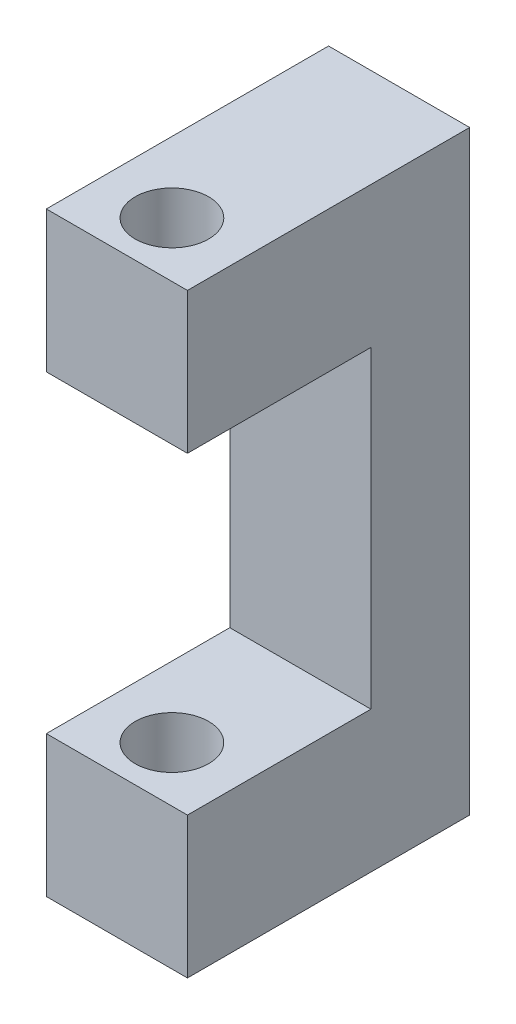
ISO-10303-21;
HEADER;
FILE_DESCRIPTION(('STEP AP214'),'2;1');
FILE_NAME('part.step','',(''),(''),'','','');
FILE_SCHEMA(('AUTOMOTIVE_DESIGN { 1 0 10303 214 1 1 1 1 }'));
ENDSEC;
DATA;
#1=APPLICATION_CONTEXT('core data for automotive mechanical design processes');
#2=APPLICATION_PROTOCOL_DEFINITION('international standard','automotive_design',2000,#1);
#3=PRODUCT_CONTEXT('',#1,'mechanical');
#4=PRODUCT('Part','Part','',(#3));
#5=PRODUCT_RELATED_PRODUCT_CATEGORY('part','',(#4));
#6=PRODUCT_DEFINITION_FORMATION('','',#4);
#7=PRODUCT_DEFINITION_CONTEXT('part definition',#1,'design');
#8=PRODUCT_DEFINITION('design','',#6,#7);
#9=PRODUCT_DEFINITION_SHAPE('','',#8);
#10=(LENGTH_UNIT() NAMED_UNIT(*) SI_UNIT(.MILLI.,.METRE.));
#11=(NAMED_UNIT(*) PLANE_ANGLE_UNIT() SI_UNIT($,.RADIAN.));
#12=(NAMED_UNIT(*) SI_UNIT($,.STERADIAN.) SOLID_ANGLE_UNIT());
#13=UNCERTAINTY_MEASURE_WITH_UNIT(LENGTH_MEASURE(1.E-05),#10,'distance_accuracy_value','');
#14=(GEOMETRIC_REPRESENTATION_CONTEXT(3) GLOBAL_UNCERTAINTY_ASSIGNED_CONTEXT((#13)) GLOBAL_UNIT_ASSIGNED_CONTEXT((#10,
#11,#12)) REPRESENTATION_CONTEXT('',''));
#15=CARTESIAN_POINT('',(0.,0.,0.));
#16=DIRECTION('',(0.,0.,1.));
#17=DIRECTION('',(1.,0.,0.));
#18=AXIS2_PLACEMENT_3D('',#15,#16,#17);
#19=CARTESIAN_POINT('',(-5.,-72.7336092564536,3.));
#20=DIRECTION('',(0.,0.,-1.));
#21=DIRECTION('',(-1.,0.,0.));
#22=AXIS2_PLACEMENT_3D('',#19,#20,#21);
#23=CYLINDRICAL_SURFACE('',#22,2.1);
#24=CARTESIAN_POINT('',(-5.,-72.7336092564536,6.));
#25=DIRECTION('',(0.,0.,1.));
#26=DIRECTION('',(1.,0.,0.));
#27=AXIS2_PLACEMENT_3D('',#24,#25,#26);
#28=CIRCLE('',#27,2.1);
#29=CARTESIAN_POINT('',(-2.9,-72.7336092564536,6.));
#30=VERTEX_POINT('',#29);
#31=EDGE_CURVE('E94',#30,#30,#28,.F.);
#32=ORIENTED_EDGE('',*,*,#31,.F.);
#33=EDGE_LOOP('',(#32));
#34=FACE_BOUND('',#33,.T.);
#35=CARTESIAN_POINT('',(-5.,-72.7336092564536,-2.));
#36=DIRECTION('',(0.,0.,-1.));
#37=DIRECTION('',(-1.,0.,0.));
#38=AXIS2_PLACEMENT_3D('',#35,#36,#37);
#39=CIRCLE('',#38,2.10000000000001);
#40=CARTESIAN_POINT('',(-7.10000000000001,-72.7336092564536,-2.));
#41=VERTEX_POINT('',#40);
#42=EDGE_CURVE('E190',#41,#41,#39,.T.);
#43=ORIENTED_EDGE('',*,*,#42,.T.);
#44=EDGE_LOOP('',(#43));
#45=FACE_BOUND('',#44,.T.);
#46=ADVANCED_FACE('F45',(#34,#45),#23,.F.);
#47=CARTESIAN_POINT('',(0.,0.,6.));
#48=DIRECTION('',(0.,0.,-1.));
#49=DIRECTION('',(-1.,0.,0.));
#50=AXIS2_PLACEMENT_3D('',#47,#48,#49);
#51=PLANE('',#50);
#52=ORIENTED_EDGE('',*,*,#31,.T.);
#53=EDGE_LOOP('',(#52));
#54=FACE_BOUND('',#53,.T.);
#55=ADVANCED_FACE('F202',(#54),#51,.T.);
#56=CARTESIAN_POINT('',(0.,0.,-2.));
#57=DIRECTION('',(0.,0.,-1.));
#58=DIRECTION('',(-1.,0.,0.));
#59=AXIS2_PLACEMENT_3D('',#56,#57,#58);
#60=PLANE('',#59);
#61=ORIENTED_EDGE('',*,*,#42,.F.);
#62=EDGE_LOOP('',(#61));
#63=FACE_BOUND('',#62,.T.);
#64=DIRECTION('',(0.,1.,0.));
#65=VECTOR('',#64,1.);
#66=CARTESIAN_POINT('',(-10.,-79.7336092564536,-2.));
#67=LINE('',#66,#65);
#68=CARTESIAN_POINT('',(-10.,-79.7336092564536,-2.));
#69=VERTEX_POINT('',#68);
#70=CARTESIAN_POINT('',(-10.,-37.5336092564536,-2.));
#71=VERTEX_POINT('',#70);
#72=EDGE_CURVE('E161',#69,#71,#67,.T.);
#73=ORIENTED_EDGE('',*,*,#72,.T.);
#74=DIRECTION('',(1.,0.,0.));
#75=VECTOR('',#74,1.);
#76=CARTESIAN_POINT('',(-10.,-37.5336092564536,-2.));
#77=LINE('',#76,#75);
#78=CARTESIAN_POINT('',(0.,-37.5336092564536,-2.));
#79=VERTEX_POINT('',#78);
#80=EDGE_CURVE('E186',#71,#79,#77,.T.);
#81=ORIENTED_EDGE('',*,*,#80,.T.);
#82=DIRECTION('',(0.,-1.,0.));
#83=VECTOR('',#82,1.);
#84=CARTESIAN_POINT('',(0.,-79.7336092564536,-2.));
#85=LINE('',#84,#83);
#86=CARTESIAN_POINT('',(0.,-79.7336092564536,-2.));
#87=VERTEX_POINT('',#86);
#88=EDGE_CURVE('E183',#79,#87,#85,.T.);
#89=ORIENTED_EDGE('',*,*,#88,.T.);
#90=DIRECTION('',(-1.,0.,0.));
#91=VECTOR('',#90,1.);
#92=CARTESIAN_POINT('',(-10.,-79.7336092564536,-2.));
#93=LINE('',#92,#91);
#94=EDGE_CURVE('E181',#87,#69,#93,.T.);
#95=ORIENTED_EDGE('',*,*,#94,.T.);
#96=EDGE_LOOP('',(#73,#81,#89,#95));
#97=FACE_BOUND('',#96,.T.);
#98=CARTESIAN_POINT('',(-5.,-44.5336092564536,-2.));
#99=DIRECTION('',(0.,0.,-1.));
#100=DIRECTION('',(-1.,0.,0.));
#101=AXIS2_PLACEMENT_3D('',#98,#99,#100);
#102=CIRCLE('',#101,2.10000000000001);
#103=CARTESIAN_POINT('',(-7.10000000000001,-44.5336092564536,-2.));
#104=VERTEX_POINT('',#103);
#105=EDGE_CURVE('E193',#104,#104,#102,.T.);
#106=ORIENTED_EDGE('',*,*,#105,.F.);
#107=EDGE_LOOP('',(#106));
#108=FACE_BOUND('',#107,.T.);
#109=ADVANCED_FACE('F199',(#63,#97,#108),#60,.T.);
#110=CARTESIAN_POINT('',(-5.,-30.7336092564536,14.1));
#111=DIRECTION('',(0.,-1.,0.));
#112=DIRECTION('',(0.,0.,-1.));
#113=AXIS2_PLACEMENT_3D('',#110,#111,#112);
#114=CYLINDRICAL_SURFACE('',#113,2.6);
#115=CARTESIAN_POINT('',(-5.,-47.5336092564536,14.1));
#116=DIRECTION('',(0.,1.,0.));
#117=DIRECTION('',(0.,0.,1.));
#118=AXIS2_PLACEMENT_3D('',#115,#116,#117);
#119=CIRCLE('',#118,2.6);
#120=CARTESIAN_POINT('',(-5.,-47.5336092564536,16.7));
#121=VERTEX_POINT('',#120);
#122=EDGE_CURVE('E48',#121,#121,#119,.T.);
#123=ORIENTED_EDGE('',*,*,#122,.F.);
#124=EDGE_LOOP('',(#123));
#125=FACE_BOUND('',#124,.T.);
#126=CARTESIAN_POINT('',(-5.,-37.5336092564536,14.1));
#127=DIRECTION('',(0.,1.,0.));
#128=DIRECTION('',(0.,0.,1.));
#129=AXIS2_PLACEMENT_3D('',#126,#127,#128);
#130=CIRCLE('',#129,2.6);
#131=CARTESIAN_POINT('',(-5.,-37.5336092564536,16.7));
#132=VERTEX_POINT('',#131);
#133=EDGE_CURVE('E178',#132,#132,#130,.T.);
#134=ORIENTED_EDGE('',*,*,#133,.T.);
#135=EDGE_LOOP('',(#134));
#136=FACE_BOUND('',#135,.T.);
#137=ADVANCED_FACE('F201',(#125,#136),#114,.F.);
#138=CARTESIAN_POINT('',(0.,-69.7336092564536,6.));
#139=DIRECTION('',(0.,1.,0.));
#140=DIRECTION('',(0.,0.,1.));
#141=AXIS2_PLACEMENT_3D('',#138,#139,#140);
#142=PLANE('',#141);
#143=DIRECTION('',(1.,0.,0.));
#144=VECTOR('',#143,1.);
#145=CARTESIAN_POINT('',(-10.,-69.7336092564536,5.));
#146=LINE('',#145,#144);
#147=CARTESIAN_POINT('',(-10.,-69.7336092564536,5.));
#148=VERTEX_POINT('',#147);
#149=CARTESIAN_POINT('',(0.,-69.7336092564536,5.));
#150=VERTEX_POINT('',#149);
#151=EDGE_CURVE('E141',#148,#150,#146,.T.);
#152=ORIENTED_EDGE('',*,*,#151,.F.);
#153=DIRECTION('',(0.,0.,-1.));
#154=VECTOR('',#153,1.);
#155=CARTESIAN_POINT('',(-10.,-69.7336092564536,6.));
#156=LINE('',#155,#154);
#157=CARTESIAN_POINT('',(-10.,-69.7336092564536,18.));
#158=VERTEX_POINT('',#157);
#159=EDGE_CURVE('E93',#158,#148,#156,.T.);
#160=ORIENTED_EDGE('',*,*,#159,.F.);
#161=DIRECTION('',(-1.,0.,0.));
#162=VECTOR('',#161,1.);
#163=CARTESIAN_POINT('',(0.,-69.7336092564536,18.));
#164=LINE('',#163,#162);
#165=CARTESIAN_POINT('',(0.,-69.7336092564536,18.));
#166=VERTEX_POINT('',#165);
#167=EDGE_CURVE('E97',#166,#158,#164,.T.);
#168=ORIENTED_EDGE('',*,*,#167,.F.);
#169=DIRECTION('',(0.,0.,-1.));
#170=VECTOR('',#169,1.);
#171=CARTESIAN_POINT('',(0.,-69.7336092564536,6.));
#172=LINE('',#171,#170);
#173=EDGE_CURVE('E82',#166,#150,#172,.T.);
#174=ORIENTED_EDGE('',*,*,#173,.T.);
#175=EDGE_LOOP('',(#152,#160,#168,#174));
#176=FACE_BOUND('',#175,.T.);
#177=CARTESIAN_POINT('',(-5.,-69.7336092564536,14.1));
#178=DIRECTION('',(0.,1.,0.));
#179=DIRECTION('',(0.,0.,1.));
#180=AXIS2_PLACEMENT_3D('',#177,#178,#179);
#181=CIRCLE('',#180,2.6);
#182=CARTESIAN_POINT('',(-5.,-69.7336092564536,16.7));
#183=VERTEX_POINT('',#182);
#184=EDGE_CURVE('E140',#183,#183,#181,.T.);
#185=ORIENTED_EDGE('',*,*,#184,.F.);
#186=EDGE_LOOP('',(#185));
#187=FACE_BOUND('',#186,.T.);
#188=ADVANCED_FACE('F98',(#176,#187),#142,.T.);
#189=CARTESIAN_POINT('',(0.,0.,5.));
#190=DIRECTION('',(0.,0.,1.));
#191=DIRECTION('',(1.,0.,0.));
#192=AXIS2_PLACEMENT_3D('',#189,#190,#191);
#193=PLANE('',#192);
#194=DIRECTION('',(0.,-1.,0.));
#195=VECTOR('',#194,1.);
#196=CARTESIAN_POINT('',(-10.,-47.5336092564536,5.));
#197=LINE('',#196,#195);
#198=CARTESIAN_POINT('',(-10.,-47.5336092564536,5.));
#199=VERTEX_POINT('',#198);
#200=EDGE_CURVE('E129',#199,#148,#197,.T.);
#201=ORIENTED_EDGE('',*,*,#200,.T.);
#202=ORIENTED_EDGE('',*,*,#151,.T.);
#203=DIRECTION('',(0.,1.,0.));
#204=VECTOR('',#203,1.);
#205=CARTESIAN_POINT('',(0.,-47.5336092564536,5.));
#206=LINE('',#205,#204);
#207=CARTESIAN_POINT('',(0.,-47.5336092564536,5.));
#208=VERTEX_POINT('',#207);
#209=EDGE_CURVE('E61',#150,#208,#206,.T.);
#210=ORIENTED_EDGE('',*,*,#209,.T.);
#211=DIRECTION('',(-1.,0.,0.));
#212=VECTOR('',#211,1.);
#213=CARTESIAN_POINT('',(-10.,-47.5336092564536,5.));
#214=LINE('',#213,#212);
#215=EDGE_CURVE('E136',#208,#199,#214,.T.);
#216=ORIENTED_EDGE('',*,*,#215,.T.);
#217=EDGE_LOOP('',(#201,#202,#210,#216));
#218=FACE_BOUND('',#217,.T.);
#219=ADVANCED_FACE('F137',(#218),#193,.T.);
#220=CARTESIAN_POINT('',(0.,-47.5336092564536,6.));
#221=DIRECTION('',(0.,1.,0.));
#222=DIRECTION('',(0.,0.,1.));
#223=AXIS2_PLACEMENT_3D('',#220,#221,#222);
#224=PLANE('',#223);
#225=ORIENTED_EDGE('',*,*,#122,.T.);
#226=EDGE_LOOP('',(#225));
#227=FACE_BOUND('',#226,.T.);
#228=DIRECTION('',(0.,0.,-1.));
#229=VECTOR('',#228,1.);
#230=CARTESIAN_POINT('',(-10.,-47.5336092564536,6.));
#231=LINE('',#230,#229);
#232=CARTESIAN_POINT('',(-10.,-47.5336092564536,18.));
#233=VERTEX_POINT('',#232);
#234=EDGE_CURVE('E11',#233,#199,#231,.T.);
#235=ORIENTED_EDGE('',*,*,#234,.T.);
#236=ORIENTED_EDGE('',*,*,#215,.F.);
#237=DIRECTION('',(0.,0.,-1.));
#238=VECTOR('',#237,1.);
#239=CARTESIAN_POINT('',(0.,-47.5336092564536,6.));
#240=LINE('',#239,#238);
#241=CARTESIAN_POINT('',(0.,-47.5336092564536,18.));
#242=VERTEX_POINT('',#241);
#243=EDGE_CURVE('E53',#242,#208,#240,.T.);
#244=ORIENTED_EDGE('',*,*,#243,.F.);
#245=DIRECTION('',(1.,0.,0.));
#246=VECTOR('',#245,1.);
#247=CARTESIAN_POINT('',(-10.,-47.5336092564536,18.));
#248=LINE('',#247,#246);
#249=EDGE_CURVE('E113',#233,#242,#248,.T.);
#250=ORIENTED_EDGE('',*,*,#249,.F.);
#251=EDGE_LOOP('',(#235,#236,#244,#250));
#252=FACE_BOUND('',#251,.T.);
#253=ADVANCED_FACE('F238',(#227,#252),#224,.F.);
#254=CARTESIAN_POINT('',(0.,0.,18.));
#255=DIRECTION('',(0.,0.,1.));
#256=DIRECTION('',(1.,0.,0.));
#257=AXIS2_PLACEMENT_3D('',#254,#255,#256);
#258=PLANE('',#257);
#259=DIRECTION('',(0.,-1.,0.));
#260=VECTOR('',#259,1.);
#261=CARTESIAN_POINT('',(-10.,-41.5336092564536,18.));
#262=LINE('',#261,#260);
#263=CARTESIAN_POINT('',(-10.,-37.5336092564536,18.));
#264=VERTEX_POINT('',#263);
#265=EDGE_CURVE('E110',#264,#233,#262,.T.);
#266=ORIENTED_EDGE('',*,*,#265,.T.);
#267=ORIENTED_EDGE('',*,*,#249,.T.);
#268=DIRECTION('',(0.,1.,0.));
#269=VECTOR('',#268,1.);
#270=CARTESIAN_POINT('',(0.,-41.5336092564536,18.));
#271=LINE('',#270,#269);
#272=CARTESIAN_POINT('',(0.,-37.5336092564536,18.));
#273=VERTEX_POINT('',#272);
#274=EDGE_CURVE('E122',#242,#273,#271,.T.);
#275=ORIENTED_EDGE('',*,*,#274,.T.);
#276=DIRECTION('',(1.,0.,0.));
#277=VECTOR('',#276,1.);
#278=CARTESIAN_POINT('',(0.,-37.5336092564536,18.));
#279=LINE('',#278,#277);
#280=EDGE_CURVE('E166',#264,#273,#279,.T.);
#281=ORIENTED_EDGE('',*,*,#280,.F.);
#282=EDGE_LOOP('',(#266,#267,#275,#281));
#283=FACE_BOUND('',#282,.T.);
#284=ADVANCED_FACE('F235',(#283),#258,.T.);
#285=ORIENTED_EDGE('',*,*,#184,.T.);
#286=EDGE_LOOP('',(#285));
#287=FACE_BOUND('',#286,.T.);
#288=CARTESIAN_POINT('',(-5.,-79.7336092564536,14.1));
#289=DIRECTION('',(0.,-1.,0.));
#290=DIRECTION('',(0.,0.,-1.));
#291=AXIS2_PLACEMENT_3D('',#288,#289,#290);
#292=CIRCLE('',#291,2.6);
#293=CARTESIAN_POINT('',(-5.,-79.7336092564536,11.5));
#294=VERTEX_POINT('',#293);
#295=EDGE_CURVE('E162',#294,#294,#292,.T.);
#296=ORIENTED_EDGE('',*,*,#295,.T.);
#297=EDGE_LOOP('',(#296));
#298=FACE_BOUND('',#297,.T.);
#299=ADVANCED_FACE('F212',(#287,#298),#114,.F.);
#300=CARTESIAN_POINT('',(0.,0.,18.));
#301=DIRECTION('',(0.,0.,-1.));
#302=DIRECTION('',(-1.,0.,0.));
#303=AXIS2_PLACEMENT_3D('',#300,#301,#302);
#304=PLANE('',#303);
#305=DIRECTION('',(0.,1.,0.));
#306=VECTOR('',#305,1.);
#307=CARTESIAN_POINT('',(0.,-69.7336092564536,18.));
#308=LINE('',#307,#306);
#309=CARTESIAN_POINT('',(0.,-79.7336092564536,18.));
#310=VERTEX_POINT('',#309);
#311=EDGE_CURVE('E88',#310,#166,#308,.T.);
#312=ORIENTED_EDGE('',*,*,#311,.T.);
#313=ORIENTED_EDGE('',*,*,#167,.T.);
#314=DIRECTION('',(0.,-1.,0.));
#315=VECTOR('',#314,1.);
#316=CARTESIAN_POINT('',(-10.,-69.7336092564536,18.));
#317=LINE('',#316,#315);
#318=CARTESIAN_POINT('',(-10.,-79.7336092564536,18.));
#319=VERTEX_POINT('',#318);
#320=EDGE_CURVE('E104',#158,#319,#317,.T.);
#321=ORIENTED_EDGE('',*,*,#320,.T.);
#322=DIRECTION('',(-1.,0.,0.));
#323=VECTOR('',#322,1.);
#324=CARTESIAN_POINT('',(-10.,-79.7336092564536,18.));
#325=LINE('',#324,#323);
#326=EDGE_CURVE('E109',#310,#319,#325,.T.);
#327=ORIENTED_EDGE('',*,*,#326,.F.);
#328=EDGE_LOOP('',(#312,#313,#321,#327));
#329=FACE_BOUND('',#328,.T.);
#330=ADVANCED_FACE('F107',(#329),#304,.F.);
#331=CARTESIAN_POINT('',(0.,-79.7336092564536,0.));
#332=DIRECTION('',(0.,-1.,0.));
#333=DIRECTION('',(0.,0.,-1.));
#334=AXIS2_PLACEMENT_3D('',#331,#332,#333);
#335=PLANE('',#334);
#336=DIRECTION('',(0.,0.,-1.));
#337=VECTOR('',#336,1.);
#338=CARTESIAN_POINT('',(-10.,-79.7336092564536,18.));
#339=LINE('',#338,#337);
#340=EDGE_CURVE('E155',#319,#69,#339,.T.);
#341=ORIENTED_EDGE('',*,*,#340,.T.);
#342=ORIENTED_EDGE('',*,*,#94,.F.);
#343=DIRECTION('',(0.,0.,1.));
#344=VECTOR('',#343,1.);
#345=CARTESIAN_POINT('',(0.,-79.7336092564536,18.));
#346=LINE('',#345,#344);
#347=EDGE_CURVE('E157',#87,#310,#346,.T.);
#348=ORIENTED_EDGE('',*,*,#347,.T.);
#349=ORIENTED_EDGE('',*,*,#326,.T.);
#350=EDGE_LOOP('',(#341,#342,#348,#349));
#351=FACE_BOUND('',#350,.T.);
#352=ORIENTED_EDGE('',*,*,#295,.F.);
#353=EDGE_LOOP('',(#352));
#354=FACE_BOUND('',#353,.T.);
#355=ADVANCED_FACE('F151',(#351,#354),#335,.T.);
#356=CARTESIAN_POINT('',(0.,0.,3.));
#357=DIRECTION('',(-1.,0.,0.));
#358=DIRECTION('',(0.,-1.,0.));
#359=AXIS2_PLACEMENT_3D('',#356,#357,#358);
#360=PLANE('',#359);
#361=ORIENTED_EDGE('',*,*,#347,.F.);
#362=ORIENTED_EDGE('',*,*,#88,.F.);
#363=DIRECTION('',(0.,0.,-1.));
#364=VECTOR('',#363,1.);
#365=CARTESIAN_POINT('',(0.,-37.5336092564536,18.));
#366=LINE('',#365,#364);
#367=EDGE_CURVE('E175',#273,#79,#366,.T.);
#368=ORIENTED_EDGE('',*,*,#367,.F.);
#369=ORIENTED_EDGE('',*,*,#274,.F.);
#370=ORIENTED_EDGE('',*,*,#243,.T.);
#371=ORIENTED_EDGE('',*,*,#209,.F.);
#372=ORIENTED_EDGE('',*,*,#173,.F.);
#373=ORIENTED_EDGE('',*,*,#311,.F.);
#374=EDGE_LOOP('',(#361,#362,#368,#369,#370,#371,#372,#373));
#375=FACE_BOUND('',#374,.T.);
#376=ADVANCED_FACE('F85',(#375),#360,.F.);
#377=CARTESIAN_POINT('',(0.,-37.5336092564536,0.));
#378=DIRECTION('',(0.,1.,0.));
#379=DIRECTION('',(0.,0.,1.));
#380=AXIS2_PLACEMENT_3D('',#377,#378,#379);
#381=PLANE('',#380);
#382=ORIENTED_EDGE('',*,*,#367,.T.);
#383=ORIENTED_EDGE('',*,*,#80,.F.);
#384=DIRECTION('',(0.,0.,1.));
#385=VECTOR('',#384,1.);
#386=CARTESIAN_POINT('',(-10.,-37.5336092564536,18.));
#387=LINE('',#386,#385);
#388=EDGE_CURVE('E172',#71,#264,#387,.T.);
#389=ORIENTED_EDGE('',*,*,#388,.T.);
#390=ORIENTED_EDGE('',*,*,#280,.T.);
#391=EDGE_LOOP('',(#382,#383,#389,#390));
#392=FACE_BOUND('',#391,.T.);
#393=ORIENTED_EDGE('',*,*,#133,.F.);
#394=EDGE_LOOP('',(#393));
#395=FACE_BOUND('',#394,.T.);
#396=ADVANCED_FACE('F337',(#392,#395),#381,.T.);
#397=CARTESIAN_POINT('',(-10.,0.,3.));
#398=DIRECTION('',(-1.,0.,0.));
#399=DIRECTION('',(0.,-1.,0.));
#400=AXIS2_PLACEMENT_3D('',#397,#398,#399);
#401=PLANE('',#400);
#402=ORIENTED_EDGE('',*,*,#388,.F.);
#403=ORIENTED_EDGE('',*,*,#72,.F.);
#404=ORIENTED_EDGE('',*,*,#340,.F.);
#405=ORIENTED_EDGE('',*,*,#320,.F.);
#406=ORIENTED_EDGE('',*,*,#159,.T.);
#407=ORIENTED_EDGE('',*,*,#200,.F.);
#408=ORIENTED_EDGE('',*,*,#234,.F.);
#409=ORIENTED_EDGE('',*,*,#265,.F.);
#410=EDGE_LOOP('',(#402,#403,#404,#405,#406,#407,#408,#409));
#411=FACE_BOUND('',#410,.T.);
#412=ADVANCED_FACE('F127',(#411),#401,.T.);
#413=CARTESIAN_POINT('',(0.,0.,6.));
#414=DIRECTION('',(0.,0.,1.));
#415=DIRECTION('',(1.,0.,0.));
#416=AXIS2_PLACEMENT_3D('',#413,#414,#415);
#417=PLANE('',#416);
#418=CARTESIAN_POINT('',(-5.,-44.5336092564536,6.));
#419=DIRECTION('',(0.,0.,1.));
#420=DIRECTION('',(1.,0.,0.));
#421=AXIS2_PLACEMENT_3D('',#418,#419,#420);
#422=CIRCLE('',#421,2.1);
#423=CARTESIAN_POINT('',(-2.9,-44.5336092564536,6.));
#424=VERTEX_POINT('',#423);
#425=EDGE_CURVE('E117',#424,#424,#422,.F.);
#426=ORIENTED_EDGE('',*,*,#425,.T.);
#427=EDGE_LOOP('',(#426));
#428=FACE_BOUND('',#427,.T.);
#429=ADVANCED_FACE('F292',(#428),#417,.F.);
#430=CARTESIAN_POINT('',(-5.,-44.5336092564536,3.));
#431=DIRECTION('',(0.,0.,-1.));
#432=DIRECTION('',(-1.,0.,0.));
#433=AXIS2_PLACEMENT_3D('',#430,#431,#432);
#434=CYLINDRICAL_SURFACE('',#433,2.1);
#435=ORIENTED_EDGE('',*,*,#425,.F.);
#436=EDGE_LOOP('',(#435));
#437=FACE_BOUND('',#436,.T.);
#438=ORIENTED_EDGE('',*,*,#105,.T.);
#439=EDGE_LOOP('',(#438));
#440=FACE_BOUND('',#439,.T.);
#441=ADVANCED_FACE('F197',(#437,#440),#434,.F.);
#442=CLOSED_SHELL('',(#46,#55,#109,#137,#188,#219,#253,#284,#299,#330,#355,#376,#396,#412,#429,#441));
#443=MANIFOLD_SOLID_BREP('B2',#442);
#444=ADVANCED_BREP_SHAPE_REPRESENTATION('',(#18,#443),#14);
#445=SHAPE_DEFINITION_REPRESENTATION(#9,#444);
ENDSEC;
END-ISO-10303-21;
